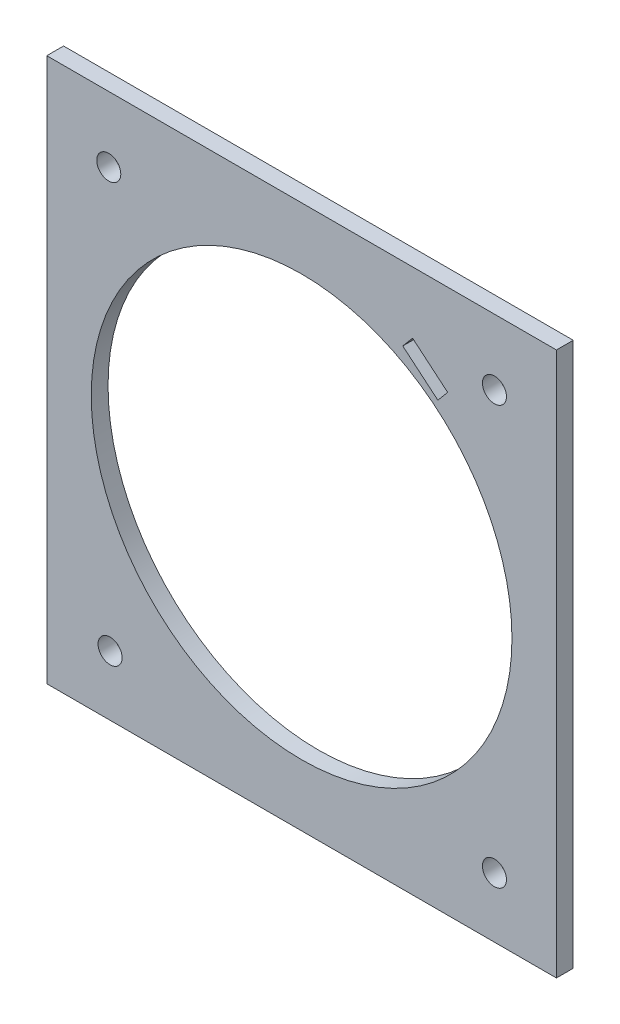
ISO-10303-21;
HEADER;
FILE_DESCRIPTION(('STEP AP214'),'2;1');
FILE_NAME('part.step','',(''),(''),'','','');
FILE_SCHEMA(('AUTOMOTIVE_DESIGN { 1 0 10303 214 1 1 1 1 }'));
ENDSEC;
DATA;
#1=APPLICATION_CONTEXT('core data for automotive mechanical design processes');
#2=APPLICATION_PROTOCOL_DEFINITION('international standard','automotive_design',2000,#1);
#3=PRODUCT_CONTEXT('',#1,'mechanical');
#4=PRODUCT('Part','Part','',(#3));
#5=PRODUCT_RELATED_PRODUCT_CATEGORY('part','',(#4));
#6=PRODUCT_DEFINITION_FORMATION('','',#4);
#7=PRODUCT_DEFINITION_CONTEXT('part definition',#1,'design');
#8=PRODUCT_DEFINITION('design','',#6,#7);
#9=PRODUCT_DEFINITION_SHAPE('','',#8);
#10=(LENGTH_UNIT() NAMED_UNIT(*) SI_UNIT(.MILLI.,.METRE.));
#11=(NAMED_UNIT(*) PLANE_ANGLE_UNIT() SI_UNIT($,.RADIAN.));
#12=(NAMED_UNIT(*) SI_UNIT($,.STERADIAN.) SOLID_ANGLE_UNIT());
#13=UNCERTAINTY_MEASURE_WITH_UNIT(LENGTH_MEASURE(1.E-05),#10,'distance_accuracy_value','');
#14=(GEOMETRIC_REPRESENTATION_CONTEXT(3) GLOBAL_UNCERTAINTY_ASSIGNED_CONTEXT((#13)) GLOBAL_UNIT_ASSIGNED_CONTEXT((#10,
#11,#12)) REPRESENTATION_CONTEXT('',''));
#15=CARTESIAN_POINT('',(0.,0.,0.));
#16=DIRECTION('',(0.,0.,1.));
#17=DIRECTION('',(1.,0.,0.));
#18=AXIS2_PLACEMENT_3D('',#15,#16,#17);
#19=CARTESIAN_POINT('',(0.,0.,2.794));
#20=DIRECTION('',(1.,0.,0.));
#21=DIRECTION('',(0.,0.,-1.));
#22=AXIS2_PLACEMENT_3D('',#19,#20,#21);
#23=PLANE('',#22);
#24=DIRECTION('',(0.,-1.,0.));
#25=VECTOR('',#24,1.);
#26=CARTESIAN_POINT('',(0.,0.,0.));
#27=LINE('',#26,#25);
#28=CARTESIAN_POINT('',(0.,0.,0.));
#29=VERTEX_POINT('',#28);
#30=CARTESIAN_POINT('',(0.,-90.5,0.));
#31=VERTEX_POINT('',#30);
#32=EDGE_CURVE('E167',#29,#31,#27,.T.);
#33=ORIENTED_EDGE('',*,*,#32,.T.);
#34=DIRECTION('',(0.,0.,-1.));
#35=VECTOR('',#34,1.);
#36=CARTESIAN_POINT('',(0.,-90.5,2.794));
#37=LINE('',#36,#35);
#38=CARTESIAN_POINT('',(0.,-90.5,2.794));
#39=VERTEX_POINT('',#38);
#40=EDGE_CURVE('E196',#39,#31,#37,.T.);
#41=ORIENTED_EDGE('',*,*,#40,.F.);
#42=DIRECTION('',(0.,-1.,0.));
#43=VECTOR('',#42,1.);
#44=CARTESIAN_POINT('',(0.,0.,2.794));
#45=LINE('',#44,#43);
#46=CARTESIAN_POINT('',(0.,0.,2.794));
#47=VERTEX_POINT('',#46);
#48=EDGE_CURVE('E168',#47,#39,#45,.T.);
#49=ORIENTED_EDGE('',*,*,#48,.F.);
#50=DIRECTION('',(0.,0.,-1.));
#51=VECTOR('',#50,1.);
#52=CARTESIAN_POINT('',(0.,0.,2.794));
#53=LINE('',#52,#51);
#54=EDGE_CURVE('E180',#47,#29,#53,.T.);
#55=ORIENTED_EDGE('',*,*,#54,.T.);
#56=EDGE_LOOP('',(#33,#41,#49,#55));
#57=FACE_BOUND('',#56,.T.);
#58=ADVANCED_FACE('F45',(#57),#23,.F.);
#59=CARTESIAN_POINT('',(0.,-90.5,2.794));
#60=DIRECTION('',(0.,1.,0.));
#61=DIRECTION('',(0.,0.,1.));
#62=AXIS2_PLACEMENT_3D('',#59,#60,#61);
#63=PLANE('',#62);
#64=DIRECTION('',(1.,0.,0.));
#65=VECTOR('',#64,1.);
#66=CARTESIAN_POINT('',(0.,-90.5,0.));
#67=LINE('',#66,#65);
#68=CARTESIAN_POINT('',(84.8,-90.5,0.));
#69=VERTEX_POINT('',#68);
#70=EDGE_CURVE('E183',#31,#69,#67,.T.);
#71=ORIENTED_EDGE('',*,*,#70,.T.);
#72=DIRECTION('',(0.,0.,-1.));
#73=VECTOR('',#72,1.);
#74=CARTESIAN_POINT('',(84.8,-90.5,2.794));
#75=LINE('',#74,#73);
#76=CARTESIAN_POINT('',(84.8,-90.5,2.794));
#77=VERTEX_POINT('',#76);
#78=EDGE_CURVE('E194',#77,#69,#75,.T.);
#79=ORIENTED_EDGE('',*,*,#78,.F.);
#80=DIRECTION('',(1.,0.,0.));
#81=VECTOR('',#80,1.);
#82=CARTESIAN_POINT('',(0.,-90.5,2.794));
#83=LINE('',#82,#81);
#84=EDGE_CURVE('E171',#39,#77,#83,.T.);
#85=ORIENTED_EDGE('',*,*,#84,.F.);
#86=ORIENTED_EDGE('',*,*,#40,.T.);
#87=EDGE_LOOP('',(#71,#79,#85,#86));
#88=FACE_BOUND('',#87,.T.);
#89=ADVANCED_FACE('F223',(#88),#63,.F.);
#90=CARTESIAN_POINT('',(84.8,0.,2.794));
#91=DIRECTION('',(1.,0.,0.));
#92=DIRECTION('',(0.,0.,-1.));
#93=AXIS2_PLACEMENT_3D('',#90,#91,#92);
#94=PLANE('',#93);
#95=DIRECTION('',(0.,-1.,0.));
#96=VECTOR('',#95,1.);
#97=CARTESIAN_POINT('',(84.8,0.,0.));
#98=LINE('',#97,#96);
#99=CARTESIAN_POINT('',(84.8,0.,0.));
#100=VERTEX_POINT('',#99);
#101=EDGE_CURVE('E186',#100,#69,#98,.T.);
#102=ORIENTED_EDGE('',*,*,#101,.F.);
#103=DIRECTION('',(0.,0.,-1.));
#104=VECTOR('',#103,1.);
#105=CARTESIAN_POINT('',(84.8,0.,2.794));
#106=LINE('',#105,#104);
#107=CARTESIAN_POINT('',(84.8,0.,2.794));
#108=VERTEX_POINT('',#107);
#109=EDGE_CURVE('E192',#108,#100,#106,.T.);
#110=ORIENTED_EDGE('',*,*,#109,.F.);
#111=DIRECTION('',(0.,-1.,0.));
#112=VECTOR('',#111,1.);
#113=CARTESIAN_POINT('',(84.8,0.,2.794));
#114=LINE('',#113,#112);
#115=EDGE_CURVE('E174',#108,#77,#114,.T.);
#116=ORIENTED_EDGE('',*,*,#115,.T.);
#117=ORIENTED_EDGE('',*,*,#78,.T.);
#118=EDGE_LOOP('',(#102,#110,#116,#117));
#119=FACE_BOUND('',#118,.T.);
#120=ADVANCED_FACE('F228',(#119),#94,.T.);
#121=CARTESIAN_POINT('',(0.,0.,2.794));
#122=DIRECTION('',(0.,1.,0.));
#123=DIRECTION('',(0.,0.,1.));
#124=AXIS2_PLACEMENT_3D('',#121,#122,#123);
#125=PLANE('',#124);
#126=DIRECTION('',(1.,0.,0.));
#127=VECTOR('',#126,1.);
#128=CARTESIAN_POINT('',(0.,0.,0.));
#129=LINE('',#128,#127);
#130=EDGE_CURVE('E172',#29,#100,#129,.T.);
#131=ORIENTED_EDGE('',*,*,#130,.F.);
#132=ORIENTED_EDGE('',*,*,#54,.F.);
#133=DIRECTION('',(1.,0.,0.));
#134=VECTOR('',#133,1.);
#135=CARTESIAN_POINT('',(0.,0.,2.794));
#136=LINE('',#135,#134);
#137=EDGE_CURVE('E177',#47,#108,#136,.T.);
#138=ORIENTED_EDGE('',*,*,#137,.T.);
#139=ORIENTED_EDGE('',*,*,#109,.T.);
#140=EDGE_LOOP('',(#131,#132,#138,#139));
#141=FACE_BOUND('',#140,.T.);
#142=ADVANCED_FACE('F236',(#141),#125,.T.);
#143=CARTESIAN_POINT('',(0.,0.,2.794));
#144=DIRECTION('',(0.,0.,1.));
#145=DIRECTION('',(1.,0.,0.));
#146=AXIS2_PLACEMENT_3D('',#143,#144,#145);
#147=PLANE('',#146);
#148=DIRECTION('',(-0.642787609686542,-0.766044443118975,0.));
#149=VECTOR('',#148,1.);
#150=CARTESIAN_POINT('',(60.8654880832481,-10.2643652409906,2.794));
#151=LINE('',#150,#149);
#152=CARTESIAN_POINT('',(60.8654880832481,-10.2643652409906,2.794));
#153=VERTEX_POINT('',#152);
#154=CARTESIAN_POINT('',(59.2328075546442,-12.2101181265128,2.794));
#155=VERTEX_POINT('',#154);
#156=EDGE_CURVE('E59',#153,#155,#151,.T.);
#157=ORIENTED_EDGE('',*,*,#156,.F.);
#158=DIRECTION('',(-0.766044443118978,0.642787609686539,0.));
#159=VECTOR('',#158,1.);
#160=CARTESIAN_POINT('',(60.8654880832481,-10.2643652409906,2.794));
#161=LINE('',#160,#159);
#162=CARTESIAN_POINT('',(66.7027467398147,-15.162406826802,2.794));
#163=VERTEX_POINT('',#162);
#164=EDGE_CURVE('E128',#163,#153,#161,.T.);
#165=ORIENTED_EDGE('',*,*,#164,.F.);
#166=DIRECTION('',(0.64278760968654,0.766044443118977,0.));
#167=VECTOR('',#166,1.);
#168=CARTESIAN_POINT('',(66.7027467398147,-15.162406826802,2.794));
#169=LINE('',#168,#167);
#170=CARTESIAN_POINT('',(65.0700662112108,-17.1081597123242,2.794));
#171=VERTEX_POINT('',#170);
#172=EDGE_CURVE('E112',#171,#163,#169,.T.);
#173=ORIENTED_EDGE('',*,*,#172,.F.);
#174=DIRECTION('',(0.766044443118977,-0.642787609686541,0.));
#175=VECTOR('',#174,1.);
#176=CARTESIAN_POINT('',(59.2328075546442,-12.2101181265128,2.794));
#177=LINE('',#176,#175);
#178=EDGE_CURVE('E121',#155,#171,#177,.T.);
#179=ORIENTED_EDGE('',*,*,#178,.F.);
#180=EDGE_LOOP('',(#157,#165,#173,#179));
#181=FACE_BOUND('',#180,.T.);
#182=CARTESIAN_POINT('',(42.4,-45.25,2.794));
#183=DIRECTION('',(0.,0.,1.));
#184=DIRECTION('',(1.,0.,0.));
#185=AXIS2_PLACEMENT_3D('',#182,#183,#184);
#186=CIRCLE('',#185,35.);
#187=CARTESIAN_POINT('',(77.4,-45.25,2.794));
#188=VERTEX_POINT('',#187);
#189=EDGE_CURVE('E140',#188,#188,#186,.T.);
#190=ORIENTED_EDGE('',*,*,#189,.F.);
#191=EDGE_LOOP('',(#190));
#192=FACE_BOUND('',#191,.T.);
#193=CARTESIAN_POINT('',(10.5330069503955,-80.5000000000008,2.794));
#194=DIRECTION('',(0.,0.,1.));
#195=DIRECTION('',(1.,0.,0.));
#196=AXIS2_PLACEMENT_3D('',#193,#194,#195);
#197=CIRCLE('',#196,2.);
#198=CARTESIAN_POINT('',(12.5330069503955,-80.5000000000008,2.794));
#199=VERTEX_POINT('',#198);
#200=EDGE_CURVE('E164',#199,#199,#197,.T.);
#201=ORIENTED_EDGE('',*,*,#200,.F.);
#202=EDGE_LOOP('',(#201));
#203=FACE_BOUND('',#202,.T.);
#204=CARTESIAN_POINT('',(74.4849930496043,-80.5000000000008,2.794));
#205=DIRECTION('',(0.,0.,1.));
#206=DIRECTION('',(1.,0.,0.));
#207=AXIS2_PLACEMENT_3D('',#204,#205,#206);
#208=CIRCLE('',#207,2.);
#209=CARTESIAN_POINT('',(76.4849930496043,-80.5000000000008,2.794));
#210=VERTEX_POINT('',#209);
#211=EDGE_CURVE('E161',#210,#210,#208,.T.);
#212=ORIENTED_EDGE('',*,*,#211,.F.);
#213=EDGE_LOOP('',(#212));
#214=FACE_BOUND('',#213,.T.);
#215=CARTESIAN_POINT('',(74.4849930496043,-10.9049668623745,2.794));
#216=DIRECTION('',(0.,0.,1.));
#217=DIRECTION('',(1.,0.,0.));
#218=AXIS2_PLACEMENT_3D('',#215,#216,#217);
#219=CIRCLE('',#218,2.);
#220=CARTESIAN_POINT('',(76.4849930496043,-10.9049668623745,2.794));
#221=VERTEX_POINT('',#220);
#222=EDGE_CURVE('E158',#221,#221,#219,.T.);
#223=ORIENTED_EDGE('',*,*,#222,.F.);
#224=EDGE_LOOP('',(#223));
#225=FACE_BOUND('',#224,.T.);
#226=CARTESIAN_POINT('',(10.3150069503957,-10.9049668623745,2.794));
#227=DIRECTION('',(0.,0.,1.));
#228=DIRECTION('',(1.,0.,0.));
#229=AXIS2_PLACEMENT_3D('',#226,#227,#228);
#230=CIRCLE('',#229,2.);
#231=CARTESIAN_POINT('',(12.3150069503957,-10.9049668623745,2.794));
#232=VERTEX_POINT('',#231);
#233=EDGE_CURVE('E155',#232,#232,#230,.T.);
#234=ORIENTED_EDGE('',*,*,#233,.F.);
#235=EDGE_LOOP('',(#234));
#236=FACE_BOUND('',#235,.T.);
#237=ORIENTED_EDGE('',*,*,#48,.T.);
#238=ORIENTED_EDGE('',*,*,#84,.T.);
#239=ORIENTED_EDGE('',*,*,#115,.F.);
#240=ORIENTED_EDGE('',*,*,#137,.F.);
#241=EDGE_LOOP('',(#237,#238,#239,#240));
#242=FACE_BOUND('',#241,.T.);
#243=ADVANCED_FACE('F125',(#181,#192,#203,#214,#225,#236,#242),#147,.T.);
#244=CARTESIAN_POINT('',(0.,0.,0.));
#245=DIRECTION('',(0.,0.,1.));
#246=DIRECTION('',(1.,0.,0.));
#247=AXIS2_PLACEMENT_3D('',#244,#245,#246);
#248=PLANE('',#247);
#249=DIRECTION('',(-0.766044443118978,0.642787609686539,0.));
#250=VECTOR('',#249,1.);
#251=CARTESIAN_POINT('',(20.0939402628536,23.9470254976292,0.));
#252=LINE('',#251,#250);
#253=CARTESIAN_POINT('',(66.7027467398147,-15.162406826802,0.));
#254=VERTEX_POINT('',#253);
#255=CARTESIAN_POINT('',(60.8654880832481,-10.2643652409906,0.));
#256=VERTEX_POINT('',#255);
#257=EDGE_CURVE('E52',#254,#256,#252,.T.);
#258=ORIENTED_EDGE('',*,*,#257,.T.);
#259=DIRECTION('',(-0.642787609686542,-0.766044443118976,0.));
#260=VECTOR('',#259,1.);
#261=CARTESIAN_POINT('',(40.7715478203942,-34.2113907386199,0.));
#262=LINE('',#261,#260);
#263=CARTESIAN_POINT('',(59.2328075546442,-12.2101181265128,0.));
#264=VERTEX_POINT('',#263);
#265=EDGE_CURVE('E11',#256,#264,#262,.T.);
#266=ORIENTED_EDGE('',*,*,#265,.T.);
#267=DIRECTION('',(0.766044443118977,-0.642787609686541,0.));
#268=VECTOR('',#267,1.);
#269=CARTESIAN_POINT('',(18.4612597342499,22.0012726121071,0.));
#270=LINE('',#269,#268);
#271=CARTESIAN_POINT('',(65.0700662112108,-17.1081597123242,0.));
#272=VERTEX_POINT('',#271);
#273=EDGE_CURVE('E199',#264,#272,#270,.T.);
#274=ORIENTED_EDGE('',*,*,#273,.T.);
#275=DIRECTION('',(0.64278760968654,0.766044443118977,0.));
#276=VECTOR('',#275,1.);
#277=CARTESIAN_POINT('',(46.608806476961,-39.1094323244313,0.));
#278=LINE('',#277,#276);
#279=EDGE_CURVE('E115',#272,#254,#278,.T.);
#280=ORIENTED_EDGE('',*,*,#279,.T.);
#281=EDGE_LOOP('',(#258,#266,#274,#280));
#282=FACE_BOUND('',#281,.T.);
#283=CARTESIAN_POINT('',(42.4,-45.25,0.));
#284=DIRECTION('',(0.,0.,-1.));
#285=DIRECTION('',(-1.,0.,0.));
#286=AXIS2_PLACEMENT_3D('',#283,#284,#285);
#287=CIRCLE('',#286,35.);
#288=CARTESIAN_POINT('',(7.39999999999998,-45.25,0.));
#289=VERTEX_POINT('',#288);
#290=EDGE_CURVE('E135',#289,#289,#287,.T.);
#291=ORIENTED_EDGE('',*,*,#290,.F.);
#292=EDGE_LOOP('',(#291));
#293=FACE_BOUND('',#292,.T.);
#294=CARTESIAN_POINT('',(10.5330069503955,-80.5000000000008,0.));
#295=DIRECTION('',(0.,0.,1.));
#296=DIRECTION('',(-1.,0.,0.));
#297=AXIS2_PLACEMENT_3D('',#294,#295,#296);
#298=CIRCLE('',#297,2.);
#299=CARTESIAN_POINT('',(8.53300695039554,-80.5000000000008,0.));
#300=VERTEX_POINT('',#299);
#301=EDGE_CURVE('E143',#300,#300,#298,.T.);
#302=ORIENTED_EDGE('',*,*,#301,.T.);
#303=EDGE_LOOP('',(#302));
#304=FACE_BOUND('',#303,.T.);
#305=CARTESIAN_POINT('',(74.4849930496043,-80.5000000000008,0.));
#306=DIRECTION('',(0.,0.,1.));
#307=DIRECTION('',(1.,0.,0.));
#308=AXIS2_PLACEMENT_3D('',#305,#306,#307);
#309=CIRCLE('',#308,2.);
#310=CARTESIAN_POINT('',(76.4849930496043,-80.5000000000008,0.));
#311=VERTEX_POINT('',#310);
#312=EDGE_CURVE('E148',#311,#311,#309,.T.);
#313=ORIENTED_EDGE('',*,*,#312,.T.);
#314=EDGE_LOOP('',(#313));
#315=FACE_BOUND('',#314,.T.);
#316=CARTESIAN_POINT('',(74.4849930496043,-10.9049668623745,0.));
#317=DIRECTION('',(0.,0.,1.));
#318=DIRECTION('',(-1.,0.,0.));
#319=AXIS2_PLACEMENT_3D('',#316,#317,#318);
#320=CIRCLE('',#319,2.);
#321=CARTESIAN_POINT('',(72.4849930496043,-10.9049668623745,0.));
#322=VERTEX_POINT('',#321);
#323=EDGE_CURVE('E144',#322,#322,#320,.T.);
#324=ORIENTED_EDGE('',*,*,#323,.T.);
#325=EDGE_LOOP('',(#324));
#326=FACE_BOUND('',#325,.T.);
#327=CARTESIAN_POINT('',(10.3150069503957,-10.9049668623745,0.));
#328=DIRECTION('',(0.,0.,1.));
#329=DIRECTION('',(1.,0.,0.));
#330=AXIS2_PLACEMENT_3D('',#327,#328,#329);
#331=CIRCLE('',#330,2.);
#332=CARTESIAN_POINT('',(12.3150069503957,-10.9049668623745,0.));
#333=VERTEX_POINT('',#332);
#334=EDGE_CURVE('E147',#333,#333,#331,.T.);
#335=ORIENTED_EDGE('',*,*,#334,.T.);
#336=EDGE_LOOP('',(#335));
#337=FACE_BOUND('',#336,.T.);
#338=ORIENTED_EDGE('',*,*,#32,.F.);
#339=ORIENTED_EDGE('',*,*,#130,.T.);
#340=ORIENTED_EDGE('',*,*,#101,.T.);
#341=ORIENTED_EDGE('',*,*,#70,.F.);
#342=EDGE_LOOP('',(#338,#339,#340,#341));
#343=FACE_BOUND('',#342,.T.);
#344=ADVANCED_FACE('F203',(#282,#293,#304,#315,#326,#337,#343),#248,.F.);
#345=CARTESIAN_POINT('',(10.3150069503957,-10.9049668623745,0.));
#346=DIRECTION('',(0.,0.,1.));
#347=DIRECTION('',(1.,0.,0.));
#348=AXIS2_PLACEMENT_3D('',#345,#346,#347);
#349=CYLINDRICAL_SURFACE('',#348,2.);
#350=ORIENTED_EDGE('',*,*,#233,.T.);
#351=EDGE_LOOP('',(#350));
#352=FACE_BOUND('',#351,.T.);
#353=ORIENTED_EDGE('',*,*,#334,.F.);
#354=EDGE_LOOP('',(#353));
#355=FACE_BOUND('',#354,.T.);
#356=ADVANCED_FACE('F250',(#352,#355),#349,.F.);
#357=CARTESIAN_POINT('',(74.4849930496043,-10.9049668623745,0.));
#358=DIRECTION('',(0.,0.,1.));
#359=DIRECTION('',(1.,0.,0.));
#360=AXIS2_PLACEMENT_3D('',#357,#358,#359);
#361=CYLINDRICAL_SURFACE('',#360,2.);
#362=ORIENTED_EDGE('',*,*,#222,.T.);
#363=EDGE_LOOP('',(#362));
#364=FACE_BOUND('',#363,.T.);
#365=ORIENTED_EDGE('',*,*,#323,.F.);
#366=EDGE_LOOP('',(#365));
#367=FACE_BOUND('',#366,.T.);
#368=ADVANCED_FACE('F275',(#364,#367),#361,.F.);
#369=CARTESIAN_POINT('',(74.4849930496043,-80.5000000000008,0.));
#370=DIRECTION('',(0.,0.,1.));
#371=DIRECTION('',(1.,0.,0.));
#372=AXIS2_PLACEMENT_3D('',#369,#370,#371);
#373=CYLINDRICAL_SURFACE('',#372,2.);
#374=ORIENTED_EDGE('',*,*,#211,.T.);
#375=EDGE_LOOP('',(#374));
#376=FACE_BOUND('',#375,.T.);
#377=ORIENTED_EDGE('',*,*,#312,.F.);
#378=EDGE_LOOP('',(#377));
#379=FACE_BOUND('',#378,.T.);
#380=ADVANCED_FACE('F284',(#376,#379),#373,.F.);
#381=CARTESIAN_POINT('',(10.5330069503955,-80.5000000000008,0.));
#382=DIRECTION('',(0.,0.,1.));
#383=DIRECTION('',(1.,0.,0.));
#384=AXIS2_PLACEMENT_3D('',#381,#382,#383);
#385=CYLINDRICAL_SURFACE('',#384,2.);
#386=ORIENTED_EDGE('',*,*,#200,.T.);
#387=EDGE_LOOP('',(#386));
#388=FACE_BOUND('',#387,.T.);
#389=ORIENTED_EDGE('',*,*,#301,.F.);
#390=EDGE_LOOP('',(#389));
#391=FACE_BOUND('',#390,.T.);
#392=ADVANCED_FACE('F218',(#388,#391),#385,.F.);
#393=CARTESIAN_POINT('',(42.4,-45.25,10.));
#394=DIRECTION('',(0.,0.,-1.));
#395=DIRECTION('',(-1.,0.,0.));
#396=AXIS2_PLACEMENT_3D('',#393,#394,#395);
#397=CYLINDRICAL_SURFACE('',#396,35.);
#398=ORIENTED_EDGE('',*,*,#189,.T.);
#399=EDGE_LOOP('',(#398));
#400=FACE_BOUND('',#399,.T.);
#401=ORIENTED_EDGE('',*,*,#290,.T.);
#402=EDGE_LOOP('',(#401));
#403=FACE_BOUND('',#402,.T.);
#404=ADVANCED_FACE('F210',(#400,#403),#397,.F.);
#405=CARTESIAN_POINT('',(60.8654880832481,-10.2643652409906,-7.206));
#406=DIRECTION('',(-0.766044443118975,0.642787609686542,0.));
#407=DIRECTION('',(-0.642787609686542,-0.766044443118976,0.));
#408=AXIS2_PLACEMENT_3D('',#405,#406,#407);
#409=PLANE('',#408);
#410=DIRECTION('',(0.,0.,1.));
#411=VECTOR('',#410,1.);
#412=CARTESIAN_POINT('',(60.8654880832481,-10.2643652409906,-7.206));
#413=LINE('',#412,#411);
#414=EDGE_CURVE('E133',#256,#153,#413,.T.);
#415=ORIENTED_EDGE('',*,*,#414,.T.);
#416=ORIENTED_EDGE('',*,*,#156,.T.);
#417=DIRECTION('',(0.,0.,1.));
#418=VECTOR('',#417,1.);
#419=CARTESIAN_POINT('',(59.2328075546442,-12.2101181265128,-7.206));
#420=LINE('',#419,#418);
#421=EDGE_CURVE('E118',#264,#155,#420,.T.);
#422=ORIENTED_EDGE('',*,*,#421,.F.);
#423=ORIENTED_EDGE('',*,*,#265,.F.);
#424=EDGE_LOOP('',(#415,#416,#422,#423));
#425=FACE_BOUND('',#424,.T.);
#426=ADVANCED_FACE('F208',(#425),#409,.F.);
#427=CARTESIAN_POINT('',(60.8654880832481,-10.2643652409906,-7.206));
#428=DIRECTION('',(0.642787609686539,0.766044443118978,0.));
#429=DIRECTION('',(-0.766044443118978,0.642787609686539,0.));
#430=AXIS2_PLACEMENT_3D('',#427,#428,#429);
#431=PLANE('',#430);
#432=DIRECTION('',(0.,0.,1.));
#433=VECTOR('',#432,1.);
#434=CARTESIAN_POINT('',(66.7027467398147,-15.162406826802,-7.206));
#435=LINE('',#434,#433);
#436=EDGE_CURVE('E117',#254,#163,#435,.T.);
#437=ORIENTED_EDGE('',*,*,#436,.T.);
#438=ORIENTED_EDGE('',*,*,#164,.T.);
#439=ORIENTED_EDGE('',*,*,#414,.F.);
#440=ORIENTED_EDGE('',*,*,#257,.F.);
#441=EDGE_LOOP('',(#437,#438,#439,#440));
#442=FACE_BOUND('',#441,.T.);
#443=ADVANCED_FACE('F207',(#442),#431,.F.);
#444=CARTESIAN_POINT('',(66.7027467398147,-15.162406826802,-7.206));
#445=DIRECTION('',(0.766044443118977,-0.64278760968654,0.));
#446=DIRECTION('',(0.64278760968654,0.766044443118977,0.));
#447=AXIS2_PLACEMENT_3D('',#444,#445,#446);
#448=PLANE('',#447);
#449=DIRECTION('',(0.,0.,1.));
#450=VECTOR('',#449,1.);
#451=CARTESIAN_POINT('',(65.0700662112108,-17.1081597123242,-7.206));
#452=LINE('',#451,#450);
#453=EDGE_CURVE('E67',#272,#171,#452,.T.);
#454=ORIENTED_EDGE('',*,*,#453,.T.);
#455=ORIENTED_EDGE('',*,*,#172,.T.);
#456=ORIENTED_EDGE('',*,*,#436,.F.);
#457=ORIENTED_EDGE('',*,*,#279,.F.);
#458=EDGE_LOOP('',(#454,#455,#456,#457));
#459=FACE_BOUND('',#458,.T.);
#460=ADVANCED_FACE('F109',(#459),#448,.F.);
#461=CARTESIAN_POINT('',(59.2328075546442,-12.2101181265128,-7.206));
#462=DIRECTION('',(-0.642787609686541,-0.766044443118977,0.));
#463=DIRECTION('',(0.766044443118977,-0.642787609686541,0.));
#464=AXIS2_PLACEMENT_3D('',#461,#462,#463);
#465=PLANE('',#464);
#466=ORIENTED_EDGE('',*,*,#421,.T.);
#467=ORIENTED_EDGE('',*,*,#178,.T.);
#468=ORIENTED_EDGE('',*,*,#453,.F.);
#469=ORIENTED_EDGE('',*,*,#273,.F.);
#470=EDGE_LOOP('',(#466,#467,#468,#469));
#471=FACE_BOUND('',#470,.T.);
#472=ADVANCED_FACE('F122',(#471),#465,.F.);
#473=CLOSED_SHELL('',(#58,#89,#120,#142,#243,#344,#356,#368,#380,#392,#404,#426,#443,#460,#472));
#474=MANIFOLD_SOLID_BREP('B2',#473);
#475=ADVANCED_BREP_SHAPE_REPRESENTATION('',(#18,#474),#14);
#476=SHAPE_DEFINITION_REPRESENTATION(#9,#475);
ENDSEC;
END-ISO-10303-21;
